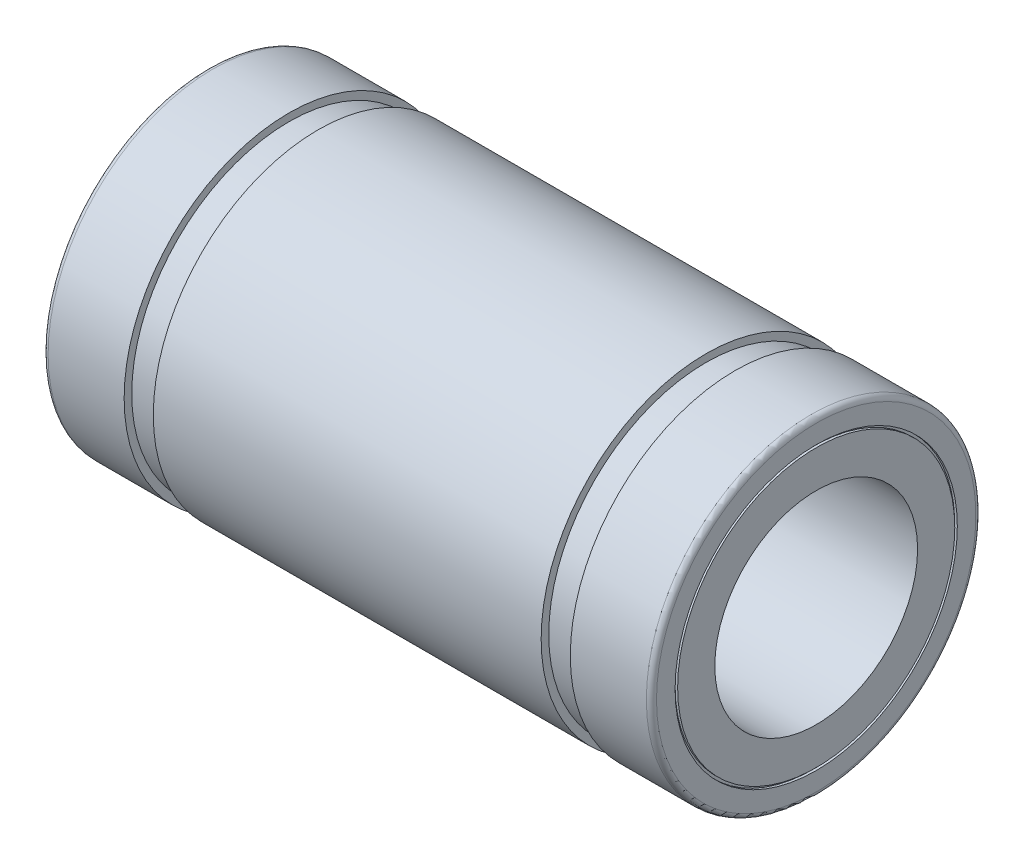
ISO-10303-21;
HEADER;
FILE_DESCRIPTION(('STEP AP214'),'2;1');
FILE_NAME('part.step','',(''),(''),'','','');
FILE_SCHEMA(('AUTOMOTIVE_DESIGN { 1 0 10303 214 1 1 1 1 }'));
ENDSEC;
DATA;
#1=APPLICATION_CONTEXT('core data for automotive mechanical design processes');
#2=APPLICATION_PROTOCOL_DEFINITION('international standard','automotive_design',2000,#1);
#3=PRODUCT_CONTEXT('',#1,'mechanical');
#4=PRODUCT('Part','Part','',(#3));
#5=PRODUCT_RELATED_PRODUCT_CATEGORY('part','',(#4));
#6=PRODUCT_DEFINITION_FORMATION('','',#4);
#7=PRODUCT_DEFINITION_CONTEXT('part definition',#1,'design');
#8=PRODUCT_DEFINITION('design','',#6,#7);
#9=PRODUCT_DEFINITION_SHAPE('','',#8);
#10=(LENGTH_UNIT() NAMED_UNIT(*) SI_UNIT(.MILLI.,.METRE.));
#11=(NAMED_UNIT(*) PLANE_ANGLE_UNIT() SI_UNIT($,.RADIAN.));
#12=(NAMED_UNIT(*) SI_UNIT($,.STERADIAN.) SOLID_ANGLE_UNIT());
#13=UNCERTAINTY_MEASURE_WITH_UNIT(LENGTH_MEASURE(1.E-05),#10,'distance_accuracy_value','');
#14=(GEOMETRIC_REPRESENTATION_CONTEXT(3) GLOBAL_UNCERTAINTY_ASSIGNED_CONTEXT((#13)) GLOBAL_UNIT_ASSIGNED_CONTEXT((#10,
#11,#12)) REPRESENTATION_CONTEXT('',''));
#15=CARTESIAN_POINT('',(0.,0.,0.));
#16=DIRECTION('',(0.,0.,1.));
#17=DIRECTION('',(1.,0.,0.));
#18=AXIS2_PLACEMENT_3D('',#15,#16,#17);
#19=CARTESIAN_POINT('',(-12.,-6.47214093325049,-6.3));
#20=DIRECTION('',(-1.,0.,0.));
#21=DIRECTION('',(0.,0.,1.));
#22=AXIS2_PLACEMENT_3D('',#19,#20,#21);
#23=PLANE('',#22);
#24=CARTESIAN_POINT('',(-12.,0.,0.));
#25=DIRECTION('',(-1.,0.,0.));
#26=DIRECTION('',(0.,0.,-1.));
#27=AXIS2_PLACEMENT_3D('',#24,#25,#26);
#28=CIRCLE('',#27,6.30000004777622);
#29=CARTESIAN_POINT('',(-12.,0.,-6.30000004777622));
#30=VERTEX_POINT('',#29);
#31=EDGE_CURVE('E86',#30,#30,#28,.F.);
#32=ORIENTED_EDGE('',*,*,#31,.F.);
#33=EDGE_LOOP('',(#32));
#34=FACE_BOUND('',#33,.T.);
#35=CARTESIAN_POINT('',(-12.,0.,0.));
#36=DIRECTION('',(1.,0.,0.));
#37=DIRECTION('',(0.,-1.16848965633094E-09,1.));
#38=AXIS2_PLACEMENT_3D('',#35,#36,#37);
#39=CIRCLE('',#38,5.5666666666667);
#40=CARTESIAN_POINT('',(-12.,-6.50459242024226E-09,5.5666666666667));
#41=VERTEX_POINT('',#40);
#42=EDGE_CURVE('E83',#41,#41,#39,.T.);
#43=ORIENTED_EDGE('',*,*,#42,.T.);
#44=EDGE_LOOP('',(#43));
#45=FACE_BOUND('',#44,.T.);
#46=ADVANCED_FACE('F15',(#34,#45),#23,.T.);
#47=CARTESIAN_POINT('',(-11.9,-5.5666666666667,-5.5666666666667));
#48=DIRECTION('',(-1.,0.,0.));
#49=DIRECTION('',(0.,0.,1.));
#50=AXIS2_PLACEMENT_3D('',#47,#48,#49);
#51=PLANE('',#50);
#52=CARTESIAN_POINT('',(-11.9,0.,0.));
#53=DIRECTION('',(-1.,0.,0.));
#54=DIRECTION('',(0.,0.,-1.));
#55=AXIS2_PLACEMENT_3D('',#52,#53,#54);
#56=CIRCLE('',#55,5.5666666666667);
#57=CARTESIAN_POINT('',(-11.9,0.,-5.5666666666667));
#58=VERTEX_POINT('',#57);
#59=EDGE_CURVE('E80',#58,#58,#56,.F.);
#60=ORIENTED_EDGE('',*,*,#59,.F.);
#61=EDGE_LOOP('',(#60));
#62=FACE_BOUND('',#61,.T.);
#63=CARTESIAN_POINT('',(-11.9,0.,0.));
#64=DIRECTION('',(1.,0.,0.));
#65=DIRECTION('',(0.,0.,1.));
#66=AXIS2_PLACEMENT_3D('',#63,#64,#65);
#67=CIRCLE('',#66,5.4666666666667);
#68=CARTESIAN_POINT('',(-11.9,0.,5.4666666666667));
#69=VERTEX_POINT('',#68);
#70=EDGE_CURVE('E77',#69,#69,#67,.T.);
#71=ORIENTED_EDGE('',*,*,#70,.T.);
#72=EDGE_LOOP('',(#71));
#73=FACE_BOUND('',#72,.T.);
#74=ADVANCED_FACE('F95',(#62,#73),#51,.T.);
#75=CARTESIAN_POINT('',(11.9,-5.5666666666667,5.5666666666667));
#76=DIRECTION('',(1.,0.,0.));
#77=DIRECTION('',(0.,0.,-1.));
#78=AXIS2_PLACEMENT_3D('',#75,#76,#77);
#79=PLANE('',#78);
#80=CARTESIAN_POINT('',(11.9,0.,0.));
#81=DIRECTION('',(1.,0.,0.));
#82=DIRECTION('',(0.,-1.16849013498997E-09,1.));
#83=AXIS2_PLACEMENT_3D('',#80,#81,#82);
#84=CIRCLE('',#83,5.5666666666667);
#85=CARTESIAN_POINT('',(11.9,-6.50459508477752E-09,5.5666666666667));
#86=VERTEX_POINT('',#85);
#87=EDGE_CURVE('E74',#86,#86,#84,.T.);
#88=ORIENTED_EDGE('',*,*,#87,.T.);
#89=EDGE_LOOP('',(#88));
#90=FACE_BOUND('',#89,.T.);
#91=CARTESIAN_POINT('',(11.9,0.,0.));
#92=DIRECTION('',(-1.,0.,0.));
#93=DIRECTION('',(0.,0.,-1.));
#94=AXIS2_PLACEMENT_3D('',#91,#92,#93);
#95=CIRCLE('',#94,5.4666666666667);
#96=CARTESIAN_POINT('',(11.9,0.,-5.4666666666667));
#97=VERTEX_POINT('',#96);
#98=EDGE_CURVE('E71',#97,#97,#95,.F.);
#99=ORIENTED_EDGE('',*,*,#98,.F.);
#100=EDGE_LOOP('',(#99));
#101=FACE_BOUND('',#100,.T.);
#102=ADVANCED_FACE('F184',(#90,#101),#79,.T.);
#103=CARTESIAN_POINT('',(12.,-6.47214093325049,6.3));
#104=DIRECTION('',(1.,0.,0.));
#105=DIRECTION('',(0.,0.,-1.));
#106=AXIS2_PLACEMENT_3D('',#103,#104,#105);
#107=PLANE('',#106);
#108=CARTESIAN_POINT('',(12.,0.,0.));
#109=DIRECTION('',(1.,0.,0.));
#110=DIRECTION('',(0.,0.,1.));
#111=AXIS2_PLACEMENT_3D('',#108,#109,#110);
#112=CIRCLE('',#111,6.30000004097088);
#113=CARTESIAN_POINT('',(12.,0.,6.30000004097088));
#114=VERTEX_POINT('',#113);
#115=EDGE_CURVE('E68',#114,#114,#112,.T.);
#116=ORIENTED_EDGE('',*,*,#115,.T.);
#117=EDGE_LOOP('',(#116));
#118=FACE_BOUND('',#117,.T.);
#119=CARTESIAN_POINT('',(12.,0.,0.));
#120=DIRECTION('',(-1.,0.,0.));
#121=DIRECTION('',(0.,0.,-1.));
#122=AXIS2_PLACEMENT_3D('',#119,#120,#121);
#123=CIRCLE('',#122,5.5666666666667);
#124=CARTESIAN_POINT('',(12.,0.,-5.5666666666667));
#125=VERTEX_POINT('',#124);
#126=EDGE_CURVE('E65',#125,#125,#123,.F.);
#127=ORIENTED_EDGE('',*,*,#126,.F.);
#128=EDGE_LOOP('',(#127));
#129=FACE_BOUND('',#128,.T.);
#130=ADVANCED_FACE('F180',(#118,#129),#107,.T.);
#131=CARTESIAN_POINT('',(8.8,-6.67760572478225,-6.5));
#132=DIRECTION('',(-1.,0.,0.));
#133=DIRECTION('',(0.,0.,1.));
#134=AXIS2_PLACEMENT_3D('',#131,#132,#133);
#135=PLANE('',#134);
#136=CARTESIAN_POINT('',(8.8,0.,0.));
#137=DIRECTION('',(-1.,0.,0.));
#138=DIRECTION('',(0.,0.,-1.));
#139=AXIS2_PLACEMENT_3D('',#136,#137,#138);
#140=CIRCLE('',#139,6.5);
#141=CARTESIAN_POINT('',(8.8,0.,-6.5));
#142=VERTEX_POINT('',#141);
#143=EDGE_CURVE('E62',#142,#142,#140,.F.);
#144=ORIENTED_EDGE('',*,*,#143,.F.);
#145=EDGE_LOOP('',(#144));
#146=FACE_BOUND('',#145,.T.);
#147=CARTESIAN_POINT('',(8.8,0.,0.));
#148=DIRECTION('',(1.,0.,0.));
#149=DIRECTION('',(0.,0.,1.));
#150=AXIS2_PLACEMENT_3D('',#147,#148,#149);
#151=CIRCLE('',#150,6.2);
#152=CARTESIAN_POINT('',(8.8,0.,6.2));
#153=VERTEX_POINT('',#152);
#154=EDGE_CURVE('E59',#153,#153,#151,.T.);
#155=ORIENTED_EDGE('',*,*,#154,.T.);
#156=EDGE_LOOP('',(#155));
#157=FACE_BOUND('',#156,.T.);
#158=ADVANCED_FACE('F176',(#146,#157),#135,.T.);
#159=CARTESIAN_POINT('',(7.65,-6.67760572478225,6.5));
#160=DIRECTION('',(1.,0.,0.));
#161=DIRECTION('',(0.,0.,-1.));
#162=AXIS2_PLACEMENT_3D('',#159,#160,#161);
#163=PLANE('',#162);
#164=CARTESIAN_POINT('',(7.65,0.,0.));
#165=DIRECTION('',(1.,0.,0.));
#166=DIRECTION('',(0.,0.,1.));
#167=AXIS2_PLACEMENT_3D('',#164,#165,#166);
#168=CIRCLE('',#167,6.5);
#169=CARTESIAN_POINT('',(7.65,0.,6.5));
#170=VERTEX_POINT('',#169);
#171=EDGE_CURVE('E56',#170,#170,#168,.T.);
#172=ORIENTED_EDGE('',*,*,#171,.T.);
#173=EDGE_LOOP('',(#172));
#174=FACE_BOUND('',#173,.T.);
#175=CARTESIAN_POINT('',(7.65,0.,0.));
#176=DIRECTION('',(-1.,0.,0.));
#177=DIRECTION('',(0.,0.,-1.));
#178=AXIS2_PLACEMENT_3D('',#175,#176,#177);
#179=CIRCLE('',#178,6.2);
#180=CARTESIAN_POINT('',(7.65,0.,-6.2));
#181=VERTEX_POINT('',#180);
#182=EDGE_CURVE('E53',#181,#181,#179,.F.);
#183=ORIENTED_EDGE('',*,*,#182,.F.);
#184=EDGE_LOOP('',(#183));
#185=FACE_BOUND('',#184,.T.);
#186=ADVANCED_FACE('F172',(#174,#185),#163,.T.);
#187=CARTESIAN_POINT('',(-7.65,-6.67760572478225,-6.5));
#188=DIRECTION('',(-1.,0.,0.));
#189=DIRECTION('',(0.,0.,1.));
#190=AXIS2_PLACEMENT_3D('',#187,#188,#189);
#191=PLANE('',#190);
#192=CARTESIAN_POINT('',(-7.65,0.,0.));
#193=DIRECTION('',(-1.,0.,0.));
#194=DIRECTION('',(0.,0.,-1.));
#195=AXIS2_PLACEMENT_3D('',#192,#193,#194);
#196=CIRCLE('',#195,6.5);
#197=CARTESIAN_POINT('',(-7.65,0.,-6.5));
#198=VERTEX_POINT('',#197);
#199=EDGE_CURVE('E50',#198,#198,#196,.F.);
#200=ORIENTED_EDGE('',*,*,#199,.F.);
#201=EDGE_LOOP('',(#200));
#202=FACE_BOUND('',#201,.T.);
#203=CARTESIAN_POINT('',(-7.65,0.,0.));
#204=DIRECTION('',(1.,0.,0.));
#205=DIRECTION('',(0.,0.,1.));
#206=AXIS2_PLACEMENT_3D('',#203,#204,#205);
#207=CIRCLE('',#206,6.2);
#208=CARTESIAN_POINT('',(-7.65,0.,6.2));
#209=VERTEX_POINT('',#208);
#210=EDGE_CURVE('E47',#209,#209,#207,.T.);
#211=ORIENTED_EDGE('',*,*,#210,.T.);
#212=EDGE_LOOP('',(#211));
#213=FACE_BOUND('',#212,.T.);
#214=ADVANCED_FACE('F165',(#202,#213),#191,.T.);
#215=CARTESIAN_POINT('',(-8.8,-6.67760572478225,6.5));
#216=DIRECTION('',(1.,0.,0.));
#217=DIRECTION('',(0.,0.,-1.));
#218=AXIS2_PLACEMENT_3D('',#215,#216,#217);
#219=PLANE('',#218);
#220=CARTESIAN_POINT('',(-8.8,0.,0.));
#221=DIRECTION('',(1.,0.,0.));
#222=DIRECTION('',(0.,0.,1.));
#223=AXIS2_PLACEMENT_3D('',#220,#221,#222);
#224=CIRCLE('',#223,6.5);
#225=CARTESIAN_POINT('',(-8.8,0.,6.5));
#226=VERTEX_POINT('',#225);
#227=EDGE_CURVE('E44',#226,#226,#224,.T.);
#228=ORIENTED_EDGE('',*,*,#227,.T.);
#229=EDGE_LOOP('',(#228));
#230=FACE_BOUND('',#229,.T.);
#231=CARTESIAN_POINT('',(-8.8,0.,0.));
#232=DIRECTION('',(-1.,0.,0.));
#233=DIRECTION('',(0.,0.,-1.));
#234=AXIS2_PLACEMENT_3D('',#231,#232,#233);
#235=CIRCLE('',#234,6.2);
#236=CARTESIAN_POINT('',(-8.8,0.,-6.2));
#237=VERTEX_POINT('',#236);
#238=EDGE_CURVE('E41',#237,#237,#235,.F.);
#239=ORIENTED_EDGE('',*,*,#238,.F.);
#240=EDGE_LOOP('',(#239));
#241=FACE_BOUND('',#240,.T.);
#242=ADVANCED_FACE('F160',(#230,#241),#219,.T.);
#243=CARTESIAN_POINT('',(-12.,-5.4666666666667,-5.4666666666667));
#244=DIRECTION('',(-1.,0.,0.));
#245=DIRECTION('',(0.,0.,1.));
#246=AXIS2_PLACEMENT_3D('',#243,#244,#245);
#247=PLANE('',#246);
#248=CARTESIAN_POINT('',(-12.,0.,0.));
#249=DIRECTION('',(-1.,0.,0.));
#250=DIRECTION('',(0.,0.,-1.));
#251=AXIS2_PLACEMENT_3D('',#248,#249,#250);
#252=CIRCLE('',#251,5.4666666666667);
#253=CARTESIAN_POINT('',(-12.,0.,-5.4666666666667));
#254=VERTEX_POINT('',#253);
#255=EDGE_CURVE('E38',#254,#254,#252,.F.);
#256=ORIENTED_EDGE('',*,*,#255,.F.);
#257=EDGE_LOOP('',(#256));
#258=FACE_BOUND('',#257,.T.);
#259=CARTESIAN_POINT('',(-12.,0.,0.));
#260=DIRECTION('',(1.,0.,0.));
#261=DIRECTION('',(0.,0.,1.));
#262=AXIS2_PLACEMENT_3D('',#259,#260,#261);
#263=CIRCLE('',#262,4.);
#264=CARTESIAN_POINT('',(-12.,0.,4.));
#265=VERTEX_POINT('',#264);
#266=EDGE_CURVE('E35',#265,#265,#263,.T.);
#267=ORIENTED_EDGE('',*,*,#266,.T.);
#268=EDGE_LOOP('',(#267));
#269=FACE_BOUND('',#268,.T.);
#270=ADVANCED_FACE('F113',(#258,#269),#247,.T.);
#271=CARTESIAN_POINT('',(12.,-5.4666666666667,5.4666666666667));
#272=DIRECTION('',(1.,0.,0.));
#273=DIRECTION('',(0.,0.,-1.));
#274=AXIS2_PLACEMENT_3D('',#271,#272,#273);
#275=PLANE('',#274);
#276=CARTESIAN_POINT('',(12.,0.,0.));
#277=DIRECTION('',(1.,0.,0.));
#278=DIRECTION('',(0.,0.,1.));
#279=AXIS2_PLACEMENT_3D('',#276,#277,#278);
#280=CIRCLE('',#279,5.4666666666667);
#281=CARTESIAN_POINT('',(12.,0.,5.4666666666667));
#282=VERTEX_POINT('',#281);
#283=EDGE_CURVE('E30',#282,#282,#280,.T.);
#284=ORIENTED_EDGE('',*,*,#283,.T.);
#285=EDGE_LOOP('',(#284));
#286=FACE_BOUND('',#285,.T.);
#287=CARTESIAN_POINT('',(12.,0.,0.));
#288=DIRECTION('',(-1.,0.,0.));
#289=DIRECTION('',(0.,0.,-1.));
#290=AXIS2_PLACEMENT_3D('',#287,#288,#289);
#291=CIRCLE('',#290,4.);
#292=CARTESIAN_POINT('',(12.,0.,-4.));
#293=VERTEX_POINT('',#292);
#294=EDGE_CURVE('E26',#293,#293,#291,.F.);
#295=ORIENTED_EDGE('',*,*,#294,.F.);
#296=EDGE_LOOP('',(#295));
#297=FACE_BOUND('',#296,.T.);
#298=ADVANCED_FACE('F102',(#286,#297),#275,.T.);
#299=CARTESIAN_POINT('',(12.,0.,0.));
#300=DIRECTION('',(1.,0.,0.));
#301=DIRECTION('',(0.,0.,1.));
#302=AXIS2_PLACEMENT_3D('',#299,#300,#301);
#303=CYLINDRICAL_SURFACE('',#302,5.5666666666667);
#304=ORIENTED_EDGE('',*,*,#59,.T.);
#305=EDGE_LOOP('',(#304));
#306=FACE_BOUND('',#305,.T.);
#307=ORIENTED_EDGE('',*,*,#42,.F.);
#308=EDGE_LOOP('',(#307));
#309=FACE_BOUND('',#308,.T.);
#310=ADVANCED_FACE('F99',(#306,#309),#303,.F.);
#311=CARTESIAN_POINT('',(12.,0.,0.));
#312=DIRECTION('',(1.,0.,0.));
#313=DIRECTION('',(0.,0.,1.));
#314=AXIS2_PLACEMENT_3D('',#311,#312,#313);
#315=CYLINDRICAL_SURFACE('',#314,5.5666666666667);
#316=ORIENTED_EDGE('',*,*,#126,.T.);
#317=EDGE_LOOP('',(#316));
#318=FACE_BOUND('',#317,.T.);
#319=ORIENTED_EDGE('',*,*,#87,.F.);
#320=EDGE_LOOP('',(#319));
#321=FACE_BOUND('',#320,.T.);
#322=ADVANCED_FACE('F101',(#318,#321),#315,.F.);
#323=CARTESIAN_POINT('',(11.7999999999995,0.,0.));
#324=DIRECTION('',(1.,0.,0.));
#325=DIRECTION('',(0.,0.,1.));
#326=AXIS2_PLACEMENT_3D('',#323,#324,#325);
#327=TOROIDAL_SURFACE('',#326,6.29999999999946,0.200000000000543);
#328=CARTESIAN_POINT('',(11.7999999999995,0.,0.));
#329=DIRECTION('',(1.,0.,0.));
#330=DIRECTION('',(0.,0.,1.));
#331=AXIS2_PLACEMENT_3D('',#328,#329,#330);
#332=CIRCLE('',#331,6.5);
#333=CARTESIAN_POINT('',(11.7999999999995,0.,6.5));
#334=VERTEX_POINT('',#333);
#335=EDGE_CURVE('E22',#334,#334,#332,.T.);
#336=ORIENTED_EDGE('',*,*,#335,.T.);
#337=EDGE_LOOP('',(#336));
#338=FACE_BOUND('',#337,.T.);
#339=ORIENTED_EDGE('',*,*,#115,.F.);
#340=EDGE_LOOP('',(#339));
#341=FACE_BOUND('',#340,.T.);
#342=ADVANCED_FACE('F110',(#338,#341),#327,.T.);
#343=CARTESIAN_POINT('',(12.,0.,0.));
#344=DIRECTION('',(1.,0.,0.));
#345=DIRECTION('',(0.,0.,1.));
#346=AXIS2_PLACEMENT_3D('',#343,#344,#345);
#347=CYLINDRICAL_SURFACE('',#346,6.5);
#348=ORIENTED_EDGE('',*,*,#143,.T.);
#349=EDGE_LOOP('',(#348));
#350=FACE_BOUND('',#349,.T.);
#351=ORIENTED_EDGE('',*,*,#335,.F.);
#352=EDGE_LOOP('',(#351));
#353=FACE_BOUND('',#352,.T.);
#354=ADVANCED_FACE('F120',(#350,#353),#347,.T.);
#355=CARTESIAN_POINT('',(12.,0.,0.));
#356=DIRECTION('',(1.,0.,0.));
#357=DIRECTION('',(0.,0.,1.));
#358=AXIS2_PLACEMENT_3D('',#355,#356,#357);
#359=CYLINDRICAL_SURFACE('',#358,6.2);
#360=ORIENTED_EDGE('',*,*,#182,.T.);
#361=EDGE_LOOP('',(#360));
#362=FACE_BOUND('',#361,.T.);
#363=ORIENTED_EDGE('',*,*,#154,.F.);
#364=EDGE_LOOP('',(#363));
#365=FACE_BOUND('',#364,.T.);
#366=ADVANCED_FACE('F123',(#362,#365),#359,.T.);
#367=CARTESIAN_POINT('',(12.,0.,0.));
#368=DIRECTION('',(1.,0.,0.));
#369=DIRECTION('',(0.,0.,1.));
#370=AXIS2_PLACEMENT_3D('',#367,#368,#369);
#371=CYLINDRICAL_SURFACE('',#370,6.5);
#372=ORIENTED_EDGE('',*,*,#199,.T.);
#373=EDGE_LOOP('',(#372));
#374=FACE_BOUND('',#373,.T.);
#375=ORIENTED_EDGE('',*,*,#171,.F.);
#376=EDGE_LOOP('',(#375));
#377=FACE_BOUND('',#376,.T.);
#378=ADVANCED_FACE('F127',(#374,#377),#371,.T.);
#379=CARTESIAN_POINT('',(12.,0.,0.));
#380=DIRECTION('',(1.,0.,0.));
#381=DIRECTION('',(0.,0.,1.));
#382=AXIS2_PLACEMENT_3D('',#379,#380,#381);
#383=CYLINDRICAL_SURFACE('',#382,6.2);
#384=ORIENTED_EDGE('',*,*,#238,.T.);
#385=EDGE_LOOP('',(#384));
#386=FACE_BOUND('',#385,.T.);
#387=ORIENTED_EDGE('',*,*,#210,.F.);
#388=EDGE_LOOP('',(#387));
#389=FACE_BOUND('',#388,.T.);
#390=ADVANCED_FACE('F131',(#386,#389),#383,.T.);
#391=CARTESIAN_POINT('',(12.,0.,0.));
#392=DIRECTION('',(1.,0.,0.));
#393=DIRECTION('',(0.,0.,1.));
#394=AXIS2_PLACEMENT_3D('',#391,#392,#393);
#395=CYLINDRICAL_SURFACE('',#394,6.5);
#396=CARTESIAN_POINT('',(-11.7999999999997,0.,0.));
#397=DIRECTION('',(1.,0.,0.));
#398=DIRECTION('',(0.,0.,1.));
#399=AXIS2_PLACEMENT_3D('',#396,#397,#398);
#400=CIRCLE('',#399,6.5);
#401=CARTESIAN_POINT('',(-11.7999999999997,0.,6.5));
#402=VERTEX_POINT('',#401);
#403=EDGE_CURVE('E10',#402,#402,#400,.T.);
#404=ORIENTED_EDGE('',*,*,#403,.T.);
#405=EDGE_LOOP('',(#404));
#406=FACE_BOUND('',#405,.T.);
#407=ORIENTED_EDGE('',*,*,#227,.F.);
#408=EDGE_LOOP('',(#407));
#409=FACE_BOUND('',#408,.T.);
#410=ADVANCED_FACE('F135',(#406,#409),#395,.T.);
#411=CARTESIAN_POINT('',(-11.7999999999995,0.,0.));
#412=DIRECTION('',(1.,0.,0.));
#413=DIRECTION('',(0.,0.,1.));
#414=AXIS2_PLACEMENT_3D('',#411,#412,#413);
#415=TOROIDAL_SURFACE('',#414,6.29999999999946,0.200000000000545);
#416=ORIENTED_EDGE('',*,*,#31,.T.);
#417=EDGE_LOOP('',(#416));
#418=FACE_BOUND('',#417,.T.);
#419=ORIENTED_EDGE('',*,*,#403,.F.);
#420=EDGE_LOOP('',(#419));
#421=FACE_BOUND('',#420,.T.);
#422=ADVANCED_FACE('F90',(#418,#421),#415,.T.);
#423=CARTESIAN_POINT('',(12.,0.,0.));
#424=DIRECTION('',(1.,0.,0.));
#425=DIRECTION('',(0.,0.,1.));
#426=AXIS2_PLACEMENT_3D('',#423,#424,#425);
#427=CYLINDRICAL_SURFACE('',#426,5.4666666666667);
#428=ORIENTED_EDGE('',*,*,#255,.T.);
#429=EDGE_LOOP('',(#428));
#430=FACE_BOUND('',#429,.T.);
#431=ORIENTED_EDGE('',*,*,#70,.F.);
#432=EDGE_LOOP('',(#431));
#433=FACE_BOUND('',#432,.T.);
#434=ADVANCED_FACE('F141',(#430,#433),#427,.T.);
#435=CARTESIAN_POINT('',(12.,0.,0.));
#436=DIRECTION('',(1.,0.,0.));
#437=DIRECTION('',(0.,0.,1.));
#438=AXIS2_PLACEMENT_3D('',#435,#436,#437);
#439=CYLINDRICAL_SURFACE('',#438,5.4666666666667);
#440=ORIENTED_EDGE('',*,*,#98,.T.);
#441=EDGE_LOOP('',(#440));
#442=FACE_BOUND('',#441,.T.);
#443=ORIENTED_EDGE('',*,*,#283,.F.);
#444=EDGE_LOOP('',(#443));
#445=FACE_BOUND('',#444,.T.);
#446=ADVANCED_FACE('F143',(#442,#445),#439,.T.);
#447=CARTESIAN_POINT('',(12.,0.,0.));
#448=DIRECTION('',(1.,0.,0.));
#449=DIRECTION('',(0.,1.42053899876766E-07,0.99999999999999));
#450=AXIS2_PLACEMENT_3D('',#447,#448,#449);
#451=CYLINDRICAL_SURFACE('',#450,4.);
#452=ORIENTED_EDGE('',*,*,#294,.T.);
#453=EDGE_LOOP('',(#452));
#454=FACE_BOUND('',#453,.T.);
#455=ORIENTED_EDGE('',*,*,#266,.F.);
#456=EDGE_LOOP('',(#455));
#457=FACE_BOUND('',#456,.T.);
#458=ADVANCED_FACE('F17',(#454,#457),#451,.F.);
#459=CLOSED_SHELL('',(#46,#74,#102,#130,#158,#186,#214,#242,#270,#298,#310,#322,#342,#354,#366,
#378,#390,#410,#422,#434,#446,#458));
#460=MANIFOLD_SOLID_BREP('B1',#459);
#461=ADVANCED_BREP_SHAPE_REPRESENTATION('',(#18,#460),#14);
#462=SHAPE_DEFINITION_REPRESENTATION(#9,#461);
ENDSEC;
END-ISO-10303-21;
